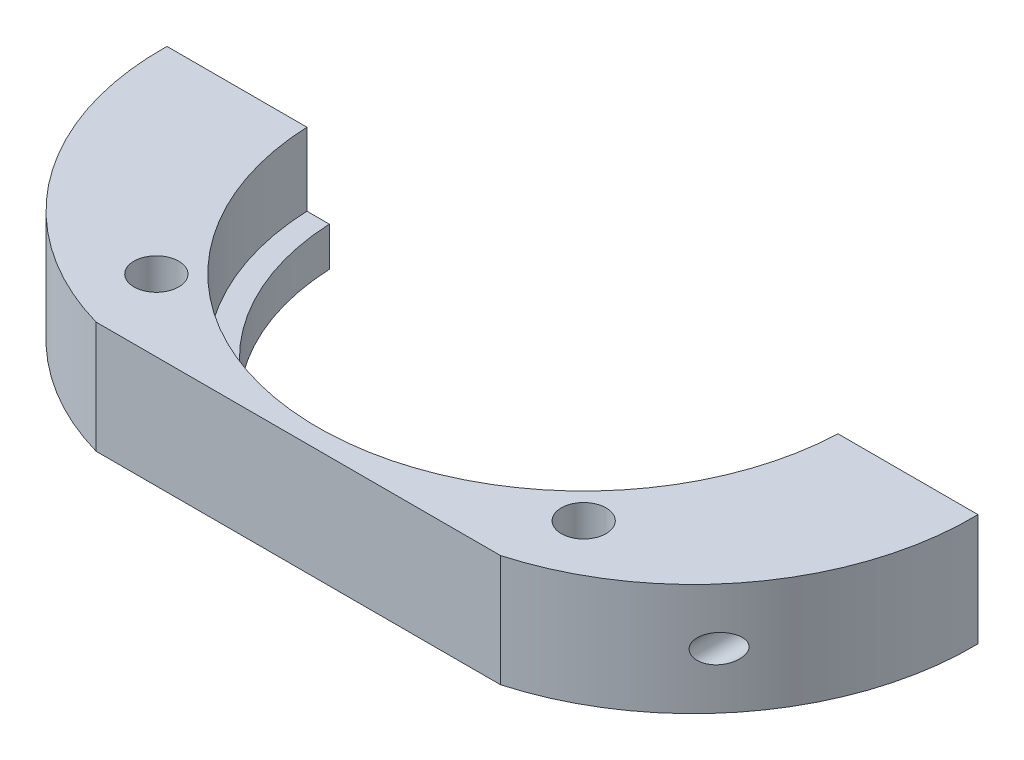
ISO-10303-21;
HEADER;
FILE_DESCRIPTION(('STEP AP214'),'2;1');
FILE_NAME('part.step','',(''),(''),'','','');
FILE_SCHEMA(('AUTOMOTIVE_DESIGN { 1 0 10303 214 1 1 1 1 }'));
ENDSEC;
DATA;
#1=APPLICATION_CONTEXT('core data for automotive mechanical design processes');
#2=APPLICATION_PROTOCOL_DEFINITION('international standard','automotive_design',2000,#1);
#3=PRODUCT_CONTEXT('',#1,'mechanical');
#4=PRODUCT('Part','Part','',(#3));
#5=PRODUCT_RELATED_PRODUCT_CATEGORY('part','',(#4));
#6=PRODUCT_DEFINITION_FORMATION('','',#4);
#7=PRODUCT_DEFINITION_CONTEXT('part definition',#1,'design');
#8=PRODUCT_DEFINITION('design','',#6,#7);
#9=PRODUCT_DEFINITION_SHAPE('','',#8);
#10=(LENGTH_UNIT() NAMED_UNIT(*) SI_UNIT(.MILLI.,.METRE.));
#11=(NAMED_UNIT(*) PLANE_ANGLE_UNIT() SI_UNIT($,.RADIAN.));
#12=(NAMED_UNIT(*) SI_UNIT($,.STERADIAN.) SOLID_ANGLE_UNIT());
#13=UNCERTAINTY_MEASURE_WITH_UNIT(LENGTH_MEASURE(1.E-05),#10,'distance_accuracy_value','');
#14=(GEOMETRIC_REPRESENTATION_CONTEXT(3) GLOBAL_UNCERTAINTY_ASSIGNED_CONTEXT((#13)) GLOBAL_UNIT_ASSIGNED_CONTEXT((#10,
#11,#12)) REPRESENTATION_CONTEXT('',''));
#15=CARTESIAN_POINT('',(0.,0.,0.));
#16=DIRECTION('',(0.,0.,1.));
#17=DIRECTION('',(1.,0.,0.));
#18=AXIS2_PLACEMENT_3D('',#15,#16,#17);
#19=CARTESIAN_POINT('',(0.,20.,0.));
#20=DIRECTION('',(0.,-1.,0.));
#21=DIRECTION('',(0.,0.,-1.));
#22=AXIS2_PLACEMENT_3D('',#19,#20,#21);
#23=CYLINDRICAL_SURFACE('',#22,43.5);
#24=DIRECTION('',(0.,-1.,0.));
#25=VECTOR('',#24,1.);
#26=CARTESIAN_POINT('',(-43.4539986652552,20.,2.));
#27=LINE('',#26,#25);
#28=CARTESIAN_POINT('',(-43.4539986652552,7.,2.));
#29=VERTEX_POINT('',#28);
#30=CARTESIAN_POINT('',(-43.4539986652552,0.,2.));
#31=VERTEX_POINT('',#30);
#32=EDGE_CURVE('E146',#29,#31,#27,.T.);
#33=ORIENTED_EDGE('',*,*,#32,.F.);
#34=CARTESIAN_POINT('',(0.,7.,0.));
#35=DIRECTION('',(0.,1.,0.));
#36=DIRECTION('',(0.,0.,1.));
#37=AXIS2_PLACEMENT_3D('',#34,#35,#36);
#38=CIRCLE('',#37,43.5);
#39=CARTESIAN_POINT('',(43.4539986652552,7.,1.99999999999999));
#40=VERTEX_POINT('',#39);
#41=EDGE_CURVE('E164',#29,#40,#38,.T.);
#42=ORIENTED_EDGE('',*,*,#41,.T.);
#43=DIRECTION('',(0.,-1.,0.));
#44=VECTOR('',#43,1.);
#45=CARTESIAN_POINT('',(43.4539986652552,20.,1.99999999999999));
#46=LINE('',#45,#44);
#47=CARTESIAN_POINT('',(43.4539986652552,0.,1.99999999999999));
#48=VERTEX_POINT('',#47);
#49=EDGE_CURVE('E65',#48,#40,#46,.F.);
#50=ORIENTED_EDGE('',*,*,#49,.F.);
#51=CARTESIAN_POINT('',(0.,0.,0.));
#52=DIRECTION('',(0.,1.,0.));
#53=DIRECTION('',(0.,0.,1.));
#54=AXIS2_PLACEMENT_3D('',#51,#52,#53);
#55=CIRCLE('',#54,43.5);
#56=EDGE_CURVE('E167',#31,#48,#55,.T.);
#57=ORIENTED_EDGE('',*,*,#56,.F.);
#58=EDGE_LOOP('',(#33,#42,#50,#57));
#59=FACE_BOUND('',#58,.T.);
#60=ADVANCED_FACE('F41',(#59),#23,.F.);
#61=CARTESIAN_POINT('',(0.,20.,0.));
#62=DIRECTION('',(0.,1.,0.));
#63=DIRECTION('',(0.,0.,1.));
#64=AXIS2_PLACEMENT_3D('',#61,#62,#63);
#65=PLANE('',#64);
#66=DIRECTION('',(1.,0.,0.));
#67=VECTOR('',#66,1.);
#68=CARTESIAN_POINT('',(-75.,20.,2.));
#69=LINE('',#68,#67);
#70=CARTESIAN_POINT('',(-72.467991803803,20.,2.));
#71=VERTEX_POINT('',#70);
#72=CARTESIAN_POINT('',(-47.4578760586691,20.,2.));
#73=VERTEX_POINT('',#72);
#74=EDGE_CURVE('E266',#71,#73,#69,.T.);
#75=ORIENTED_EDGE('',*,*,#74,.F.);
#76=CARTESIAN_POINT('',(-22.4760908283651,20.,2.89990936322075));
#77=DIRECTION('',(0.,1.,0.));
#78=DIRECTION('',(0.,0.,1.));
#79=AXIS2_PLACEMENT_3D('',#76,#77,#78);
#80=CIRCLE('',#79,50.);
#81=CARTESIAN_POINT('',(-36.1282437990003,20.,51.));
#82=VERTEX_POINT('',#81);
#83=EDGE_CURVE('E259',#82,#71,#80,.F.);
#84=ORIENTED_EDGE('',*,*,#83,.F.);
#85=DIRECTION('',(-1.,0.,0.));
#86=VECTOR('',#85,1.);
#87=CARTESIAN_POINT('',(-36.1282437990003,20.,51.));
#88=LINE('',#87,#86);
#89=CARTESIAN_POINT('',(36.1282437990003,20.,51.));
#90=VERTEX_POINT('',#89);
#91=EDGE_CURVE('E131',#90,#82,#88,.T.);
#92=ORIENTED_EDGE('',*,*,#91,.F.);
#93=CARTESIAN_POINT('',(22.4760908283651,20.,2.89990936322075));
#94=DIRECTION('',(0.,1.,0.));
#95=DIRECTION('',(0.,0.,1.));
#96=AXIS2_PLACEMENT_3D('',#93,#94,#95);
#97=CIRCLE('',#96,50.);
#98=CARTESIAN_POINT('',(72.467991803803,20.,1.99999999999999));
#99=VERTEX_POINT('',#98);
#100=EDGE_CURVE('E113',#90,#99,#97,.T.);
#101=ORIENTED_EDGE('',*,*,#100,.T.);
#102=CARTESIAN_POINT('',(47.4578760586691,20.,1.99999999999999));
#103=VERTEX_POINT('',#102);
#104=EDGE_CURVE('E136',#103,#99,#69,.T.);
#105=ORIENTED_EDGE('',*,*,#104,.F.);
#106=CARTESIAN_POINT('',(0.,20.,0.));
#107=DIRECTION('',(0.,1.,0.));
#108=DIRECTION('',(0.,0.,1.));
#109=AXIS2_PLACEMENT_3D('',#106,#107,#108);
#110=CIRCLE('',#109,47.5);
#111=EDGE_CURVE('E152',#73,#103,#110,.T.);
#112=ORIENTED_EDGE('',*,*,#111,.F.);
#113=EDGE_LOOP('',(#75,#84,#92,#101,#105,#112));
#114=FACE_BOUND('',#113,.T.);
#115=CARTESIAN_POINT('',(-38.1837661840735,20.,38.1837661840736));
#116=DIRECTION('',(0.,1.,0.));
#117=DIRECTION('',(0.,0.,1.));
#118=AXIS2_PLACEMENT_3D('',#115,#116,#117);
#119=CIRCLE('',#118,4.00000000000001);
#120=CARTESIAN_POINT('',(-38.1837661840735,20.,42.1837661840737));
#121=VERTEX_POINT('',#120);
#122=EDGE_CURVE('E148',#121,#121,#119,.T.);
#123=ORIENTED_EDGE('',*,*,#122,.F.);
#124=EDGE_LOOP('',(#123));
#125=FACE_BOUND('',#124,.T.);
#126=CARTESIAN_POINT('',(38.1837661840736,20.,38.1837661840735));
#127=DIRECTION('',(0.,1.,0.));
#128=DIRECTION('',(0.,0.,1.));
#129=AXIS2_PLACEMENT_3D('',#126,#127,#128);
#130=CIRCLE('',#129,4.00000000000001);
#131=CARTESIAN_POINT('',(38.1837661840736,20.,42.1837661840735));
#132=VERTEX_POINT('',#131);
#133=EDGE_CURVE('E153',#132,#132,#130,.T.);
#134=ORIENTED_EDGE('',*,*,#133,.F.);
#135=EDGE_LOOP('',(#134));
#136=FACE_BOUND('',#135,.T.);
#137=ADVANCED_FACE('F214',(#114,#125,#136),#65,.T.);
#138=CARTESIAN_POINT('',(0.,0.,0.));
#139=DIRECTION('',(0.,1.,0.));
#140=DIRECTION('',(0.,0.,1.));
#141=AXIS2_PLACEMENT_3D('',#138,#139,#140);
#142=PLANE('',#141);
#143=CARTESIAN_POINT('',(-38.1837661840735,0.,38.1837661840736));
#144=DIRECTION('',(0.,1.,0.));
#145=DIRECTION('',(0.,0.,1.));
#146=AXIS2_PLACEMENT_3D('',#143,#144,#145);
#147=CIRCLE('',#146,4.00000000000001);
#148=CARTESIAN_POINT('',(-38.1837661840735,0.,42.1837661840737));
#149=VERTEX_POINT('',#148);
#150=EDGE_CURVE('E156',#149,#149,#147,.T.);
#151=ORIENTED_EDGE('',*,*,#150,.T.);
#152=EDGE_LOOP('',(#151));
#153=FACE_BOUND('',#152,.T.);
#154=CARTESIAN_POINT('',(38.1837661840736,0.,38.1837661840735));
#155=DIRECTION('',(0.,1.,0.));
#156=DIRECTION('',(0.,0.,1.));
#157=AXIS2_PLACEMENT_3D('',#154,#155,#156);
#158=CIRCLE('',#157,4.00000000000001);
#159=CARTESIAN_POINT('',(38.1837661840736,0.,42.1837661840735));
#160=VERTEX_POINT('',#159);
#161=EDGE_CURVE('E149',#160,#160,#158,.T.);
#162=ORIENTED_EDGE('',*,*,#161,.T.);
#163=EDGE_LOOP('',(#162));
#164=FACE_BOUND('',#163,.T.);
#165=DIRECTION('',(-1.,0.,0.));
#166=VECTOR('',#165,1.);
#167=CARTESIAN_POINT('',(-36.1282437990003,0.,51.));
#168=LINE('',#167,#166);
#169=CARTESIAN_POINT('',(36.1282437990003,0.,51.));
#170=VERTEX_POINT('',#169);
#171=CARTESIAN_POINT('',(-36.1282437990003,0.,51.));
#172=VERTEX_POINT('',#171);
#173=EDGE_CURVE('E118',#170,#172,#168,.T.);
#174=ORIENTED_EDGE('',*,*,#173,.T.);
#175=CARTESIAN_POINT('',(-22.4760908283651,0.,2.89990936322075));
#176=DIRECTION('',(0.,1.,0.));
#177=DIRECTION('',(0.,0.,1.));
#178=AXIS2_PLACEMENT_3D('',#175,#176,#177);
#179=CIRCLE('',#178,50.);
#180=CARTESIAN_POINT('',(-72.467991803803,0.,2.));
#181=VERTEX_POINT('',#180);
#182=EDGE_CURVE('E261',#172,#181,#179,.F.);
#183=ORIENTED_EDGE('',*,*,#182,.T.);
#184=DIRECTION('',(1.,0.,0.));
#185=VECTOR('',#184,1.);
#186=CARTESIAN_POINT('',(-75.,0.,2.));
#187=LINE('',#186,#185);
#188=EDGE_CURVE('E143',#181,#31,#187,.T.);
#189=ORIENTED_EDGE('',*,*,#188,.T.);
#190=ORIENTED_EDGE('',*,*,#56,.T.);
#191=CARTESIAN_POINT('',(72.467991803803,0.,1.99999999999999));
#192=VERTEX_POINT('',#191);
#193=EDGE_CURVE('E125',#48,#192,#187,.T.);
#194=ORIENTED_EDGE('',*,*,#193,.T.);
#195=CARTESIAN_POINT('',(22.4760908283651,0.,2.89990936322075));
#196=DIRECTION('',(0.,1.,0.));
#197=DIRECTION('',(0.,0.,1.));
#198=AXIS2_PLACEMENT_3D('',#195,#196,#197);
#199=CIRCLE('',#198,50.);
#200=EDGE_CURVE('E111',#170,#192,#199,.T.);
#201=ORIENTED_EDGE('',*,*,#200,.F.);
#202=EDGE_LOOP('',(#174,#183,#189,#190,#194,#201));
#203=FACE_BOUND('',#202,.T.);
#204=ADVANCED_FACE('F43',(#153,#164,#203),#142,.F.);
#205=CARTESIAN_POINT('',(0.,7.,0.));
#206=DIRECTION('',(0.,1.,0.));
#207=DIRECTION('',(0.,0.,1.));
#208=AXIS2_PLACEMENT_3D('',#205,#206,#207);
#209=CYLINDRICAL_SURFACE('',#208,47.5);
#210=ORIENTED_EDGE('',*,*,#111,.T.);
#211=DIRECTION('',(0.,1.,0.));
#212=VECTOR('',#211,1.);
#213=CARTESIAN_POINT('',(47.4578760586691,7.,1.99999999999999));
#214=LINE('',#213,#212);
#215=CARTESIAN_POINT('',(47.4578760586691,7.,1.99999999999999));
#216=VERTEX_POINT('',#215);
#217=EDGE_CURVE('E140',#103,#216,#214,.F.);
#218=ORIENTED_EDGE('',*,*,#217,.T.);
#219=CARTESIAN_POINT('',(0.,7.,0.));
#220=DIRECTION('',(0.,1.,0.));
#221=DIRECTION('',(0.,0.,1.));
#222=AXIS2_PLACEMENT_3D('',#219,#220,#221);
#223=CIRCLE('',#222,47.5);
#224=CARTESIAN_POINT('',(-47.4578760586691,7.,2.));
#225=VERTEX_POINT('',#224);
#226=EDGE_CURVE('E161',#225,#216,#223,.T.);
#227=ORIENTED_EDGE('',*,*,#226,.F.);
#228=DIRECTION('',(0.,1.,0.));
#229=VECTOR('',#228,1.);
#230=CARTESIAN_POINT('',(-47.4578760586691,7.,2.));
#231=LINE('',#230,#229);
#232=EDGE_CURVE('E57',#225,#73,#231,.T.);
#233=ORIENTED_EDGE('',*,*,#232,.T.);
#234=EDGE_LOOP('',(#210,#218,#227,#233));
#235=FACE_BOUND('',#234,.T.);
#236=ADVANCED_FACE('F224',(#235),#209,.F.);
#237=CARTESIAN_POINT('',(0.,7.,0.));
#238=DIRECTION('',(0.,1.,0.));
#239=DIRECTION('',(0.,0.,1.));
#240=AXIS2_PLACEMENT_3D('',#237,#238,#239);
#241=PLANE('',#240);
#242=DIRECTION('',(1.,0.,0.));
#243=VECTOR('',#242,1.);
#244=CARTESIAN_POINT('',(0.,7.,1.99999999999999));
#245=LINE('',#244,#243);
#246=EDGE_CURVE('E11',#225,#29,#245,.T.);
#247=ORIENTED_EDGE('',*,*,#246,.F.);
#248=ORIENTED_EDGE('',*,*,#226,.T.);
#249=EDGE_CURVE('E50',#40,#216,#245,.T.);
#250=ORIENTED_EDGE('',*,*,#249,.F.);
#251=ORIENTED_EDGE('',*,*,#41,.F.);
#252=EDGE_LOOP('',(#247,#248,#250,#251));
#253=FACE_BOUND('',#252,.T.);
#254=ADVANCED_FACE('F226',(#253),#241,.T.);
#255=CARTESIAN_POINT('',(38.1837661840736,0.,38.1837661840735));
#256=DIRECTION('',(0.,1.,0.));
#257=DIRECTION('',(0.,0.,1.));
#258=AXIS2_PLACEMENT_3D('',#255,#256,#257);
#259=CYLINDRICAL_SURFACE('',#258,4.00000000000001);
#260=ORIENTED_EDGE('',*,*,#161,.F.);
#261=EDGE_LOOP('',(#260));
#262=FACE_BOUND('',#261,.T.);
#263=ORIENTED_EDGE('',*,*,#133,.T.);
#264=EDGE_LOOP('',(#263));
#265=FACE_BOUND('',#264,.T.);
#266=ADVANCED_FACE('F230',(#262,#265),#259,.F.);
#267=CARTESIAN_POINT('',(-38.1837661840735,0.,38.1837661840736));
#268=DIRECTION('',(0.,1.,0.));
#269=DIRECTION('',(0.,0.,1.));
#270=AXIS2_PLACEMENT_3D('',#267,#268,#269);
#271=CYLINDRICAL_SURFACE('',#270,4.00000000000001);
#272=ORIENTED_EDGE('',*,*,#150,.F.);
#273=EDGE_LOOP('',(#272));
#274=FACE_BOUND('',#273,.T.);
#275=ORIENTED_EDGE('',*,*,#122,.T.);
#276=EDGE_LOOP('',(#275));
#277=FACE_BOUND('',#276,.T.);
#278=ADVANCED_FACE('F232',(#274,#277),#271,.F.);
#279=CARTESIAN_POINT('',(-75.,0.,2.));
#280=DIRECTION('',(0.,0.,1.));
#281=DIRECTION('',(1.,0.,0.));
#282=AXIS2_PLACEMENT_3D('',#279,#280,#281);
#283=PLANE('',#282);
#284=CARTESIAN_POINT('',(59.9629339312361,10.,1.99999999999998));
#285=DIRECTION('',(0.,0.,-1.));
#286=DIRECTION('',(-1.,0.,0.));
#287=AXIS2_PLACEMENT_3D('',#284,#285,#286);
#288=CIRCLE('',#287,4.025);
#289=CARTESIAN_POINT('',(55.9379339312361,10.,1.99999999999998));
#290=VERTEX_POINT('',#289);
#291=EDGE_CURVE('E285',#290,#290,#288,.T.);
#292=ORIENTED_EDGE('',*,*,#291,.F.);
#293=EDGE_LOOP('',(#292));
#294=FACE_BOUND('',#293,.T.);
#295=ORIENTED_EDGE('',*,*,#193,.F.);
#296=ORIENTED_EDGE('',*,*,#49,.T.);
#297=ORIENTED_EDGE('',*,*,#249,.T.);
#298=ORIENTED_EDGE('',*,*,#217,.F.);
#299=ORIENTED_EDGE('',*,*,#104,.T.);
#300=DIRECTION('',(0.,1.,0.));
#301=VECTOR('',#300,1.);
#302=CARTESIAN_POINT('',(72.467991803803,0.,1.99999999999999));
#303=LINE('',#302,#301);
#304=EDGE_CURVE('E127',#192,#99,#303,.T.);
#305=ORIENTED_EDGE('',*,*,#304,.F.);
#306=EDGE_LOOP('',(#295,#296,#297,#298,#299,#305));
#307=FACE_BOUND('',#306,.T.);
#308=ADVANCED_FACE('F235',(#294,#307),#283,.F.);
#309=CARTESIAN_POINT('',(-59.9629339312361,10.,2.));
#310=DIRECTION('',(0.,0.,-1.));
#311=DIRECTION('',(-1.,0.,0.));
#312=AXIS2_PLACEMENT_3D('',#309,#310,#311);
#313=CIRCLE('',#312,4.025);
#314=CARTESIAN_POINT('',(-63.9879339312361,10.,2.));
#315=VERTEX_POINT('',#314);
#316=EDGE_CURVE('E276',#315,#315,#313,.T.);
#317=ORIENTED_EDGE('',*,*,#316,.F.);
#318=EDGE_LOOP('',(#317));
#319=FACE_BOUND('',#318,.T.);
#320=ORIENTED_EDGE('',*,*,#74,.T.);
#321=ORIENTED_EDGE('',*,*,#232,.F.);
#322=ORIENTED_EDGE('',*,*,#246,.T.);
#323=ORIENTED_EDGE('',*,*,#32,.T.);
#324=ORIENTED_EDGE('',*,*,#188,.F.);
#325=DIRECTION('',(0.,1.,0.));
#326=VECTOR('',#325,1.);
#327=CARTESIAN_POINT('',(-72.467991803803,0.,2.));
#328=LINE('',#327,#326);
#329=EDGE_CURVE('E133',#181,#71,#328,.T.);
#330=ORIENTED_EDGE('',*,*,#329,.T.);
#331=EDGE_LOOP('',(#320,#321,#322,#323,#324,#330));
#332=FACE_BOUND('',#331,.T.);
#333=ADVANCED_FACE('F243',(#319,#332),#283,.F.);
#334=CARTESIAN_POINT('',(-36.1282437990003,0.,51.));
#335=DIRECTION('',(0.,0.,-1.));
#336=DIRECTION('',(-1.,0.,0.));
#337=AXIS2_PLACEMENT_3D('',#334,#335,#336);
#338=PLANE('',#337);
#339=ORIENTED_EDGE('',*,*,#91,.T.);
#340=DIRECTION('',(0.,1.,0.));
#341=VECTOR('',#340,1.);
#342=CARTESIAN_POINT('',(-36.1282437990003,0.,51.));
#343=LINE('',#342,#341);
#344=EDGE_CURVE('E117',#172,#82,#343,.T.);
#345=ORIENTED_EDGE('',*,*,#344,.F.);
#346=ORIENTED_EDGE('',*,*,#173,.F.);
#347=DIRECTION('',(0.,1.,0.));
#348=VECTOR('',#347,1.);
#349=CARTESIAN_POINT('',(36.1282437990003,0.,51.));
#350=LINE('',#349,#348);
#351=EDGE_CURVE('E107',#170,#90,#350,.T.);
#352=ORIENTED_EDGE('',*,*,#351,.T.);
#353=EDGE_LOOP('',(#339,#345,#346,#352));
#354=FACE_BOUND('',#353,.T.);
#355=ADVANCED_FACE('F129',(#354),#338,.F.);
#356=CARTESIAN_POINT('',(-22.4760908283651,0.,2.89990936322075));
#357=DIRECTION('',(0.,1.,0.));
#358=DIRECTION('',(0.,0.,1.));
#359=AXIS2_PLACEMENT_3D('',#356,#357,#358);
#360=CYLINDRICAL_SURFACE('',#359,50.);
#361=CARTESIAN_POINT('',(-63.3629339312361,10.,31.6795212626404));
#362=CARTESIAN_POINT('',(-63.3629343253646,10.0687356319262,31.6795206866059));
#363=CARTESIAN_POINT('',(-63.3608437410406,10.1374698240647,31.6824914506178));
#364=CARTESIAN_POINT('',(-63.3525504305789,10.2742176845475,31.6942682166826));
#365=CARTESIAN_POINT('',(-63.3463454708273,10.3422309411225,31.7030773882918));
#366=CARTESIAN_POINT('',(-63.330000012413,10.4769466379987,31.7262567521344));
#367=CARTESIAN_POINT('',(-63.3198522033584,10.5436464001833,31.7406372740015));
#368=CARTESIAN_POINT('',(-63.2959116563995,10.6750789816758,31.7745116669967));
#369=CARTESIAN_POINT('',(-63.2821167406185,10.739810599864,31.7940085933437));
#370=CARTESIAN_POINT('',(-63.2361666189003,10.928744118272,31.8588283423903));
#371=CARTESIAN_POINT('',(-63.199204332202,11.0495474117393,31.9108251195941));
#372=CARTESIAN_POINT('',(-63.1151276526763,11.2801577607404,32.0284852970135));
#373=CARTESIAN_POINT('',(-63.0680105968522,11.3899619207658,32.0941522819634));
#374=CARTESIAN_POINT('',(-62.9339460467734,11.6639585438838,32.2798651443603));
#375=CARTESIAN_POINT('',(-62.8404920850483,11.8193277767616,32.4082721584818));
#376=CARTESIAN_POINT('',(-62.6897497997489,12.0327532780433,32.6130209365152));
#377=CARTESIAN_POINT('',(-62.6376326298726,12.1007344831081,32.6834394997413));
#378=CARTESIAN_POINT('',(-62.530357779274,12.2305645379109,32.8275509302823));
#379=CARTESIAN_POINT('',(-62.4752008233424,12.2924148397107,32.9012430162696));
#380=CARTESIAN_POINT('',(-62.3282770164443,12.4458713492224,33.0963637063599));
#381=CARTESIAN_POINT('',(-62.2344707353584,12.5329598756038,33.2198087728626));
#382=CARTESIAN_POINT('',(-62.0414615221016,12.693601112363,33.4712456996677));
#383=CARTESIAN_POINT('',(-61.942255430183,12.7671457846777,33.5992402065824));
#384=CARTESIAN_POINT('',(-61.7393067586724,12.9016071760518,33.8583812786916));
#385=CARTESIAN_POINT('',(-61.6355607784039,12.9625142256185,33.9895301724307));
#386=CARTESIAN_POINT('',(-61.4243091023683,13.0722211746513,34.2537753264019));
#387=CARTESIAN_POINT('',(-61.3168041074958,13.1210233175712,34.3868712209387));
#388=CARTESIAN_POINT('',(-61.0931682750898,13.2090049814337,34.6607990766237));
#389=CARTESIAN_POINT('',(-60.9768737355676,13.2475895893844,34.8016882247869));
#390=CARTESIAN_POINT('',(-60.7412824980919,13.3119608826084,35.0838945000289));
#391=CARTESIAN_POINT('',(-60.6219855269891,13.3377463990161,35.2252116650107));
#392=CARTESIAN_POINT('',(-60.3809750897698,13.3764081421366,35.5074879429977));
#393=CARTESIAN_POINT('',(-60.2592622846771,13.3892878518196,35.6484471423606));
#394=CARTESIAN_POINT('',(-60.0139737959925,13.4018339495662,35.9293219965637));
#395=CARTESIAN_POINT('',(-59.8903982779077,13.4015015047273,36.0692377424854));
#396=CARTESIAN_POINT('',(-59.6487746231976,13.3874978835237,36.339745812837));
#397=CARTESIAN_POINT('',(-59.5307903301629,13.3745513347659,36.4704321420177));
#398=CARTESIAN_POINT('',(-59.2943917157552,13.3357758356127,36.7295335686755));
#399=CARTESIAN_POINT('',(-59.1759773537051,13.3099456333906,36.8579484441934));
#400=CARTESIAN_POINT('',(-58.9396601215898,13.2446760921927,37.11157567088));
#401=CARTESIAN_POINT('',(-58.8217568827809,13.2052492210902,37.2367908435181));
#402=CARTESIAN_POINT('',(-58.5874747630514,13.1119132872493,37.4830968531318));
#403=CARTESIAN_POINT('',(-58.4710953002314,13.0580099326124,37.6041892945475));
#404=CARTESIAN_POINT('',(-58.1954991743462,12.9102251610865,37.8881482490508));
#405=CARTESIAN_POINT('',(-58.0375845106017,12.8089661898772,38.0485512001167));
#406=CARTESIAN_POINT('',(-57.7324674669168,12.5733376443751,38.3545907033303));
#407=CARTESIAN_POINT('',(-57.5852499187897,12.4390161871331,38.5002482840312));
#408=CARTESIAN_POINT('',(-57.3414023212565,12.1707746029251,38.7388834546638));
#409=CARTESIAN_POINT('',(-57.2410114427707,12.0441684277568,38.8361993242526));
#410=CARTESIAN_POINT('',(-57.0553915454894,11.7701631585125,39.0148440138304));
#411=CARTESIAN_POINT('',(-56.9701435953079,11.6227904458554,39.0961928090903));
#412=CARTESIAN_POINT('',(-56.8336231856805,11.3370827436366,39.2257573159105));
#413=CARTESIAN_POINT('',(-56.778999126389,11.2018700981031,39.2772989991099));
#414=CARTESIAN_POINT('',(-56.6866631445926,10.9208036324825,39.364149130578));
#415=CARTESIAN_POINT('',(-56.6489419646604,10.7749556881925,39.3994664649217));
#416=CARTESIAN_POINT('',(-56.5928884952155,10.4755020114979,39.451867419091));
#417=CARTESIAN_POINT('',(-56.5746601096092,10.3218592335711,39.4688533299304));
#418=CARTESIAN_POINT('',(-56.5594389170208,10.0126196060326,39.483040854107));
#419=CARTESIAN_POINT('',(-56.5624401373302,9.8570233183151,39.4802480319658));
#420=CARTESIAN_POINT('',(-56.5881873703442,9.56306350733776,39.4562372479841));
#421=CARTESIAN_POINT('',(-56.6091523964301,9.42439870879384,39.4366811778056));
#422=CARTESIAN_POINT('',(-56.6670689207072,9.15356021435374,39.3824884395396));
#423=CARTESIAN_POINT('',(-56.7040216597743,9.02138702318629,39.3478506008891));
#424=CARTESIAN_POINT('',(-56.7936378471042,8.76091828196372,39.2634882968493));
#425=CARTESIAN_POINT('',(-56.8468908656443,8.63301272092612,39.2131962153582));
#426=CARTESIAN_POINT('',(-56.9657565650929,8.38897854943374,39.1003195166353));
#427=CARTESIAN_POINT('',(-57.031376013324,8.27285644105927,39.03772816803));
#428=CARTESIAN_POINT('',(-57.2065257415862,8.00007954923629,38.8695874242304));
#429=CARTESIAN_POINT('',(-57.32194833766,7.85096807460068,38.7578986440388));
#430=CARTESIAN_POINT('',(-57.5671885174114,7.58051560199774,38.5179461230284));
#431=CARTESIAN_POINT('',(-57.6970376984098,7.45923741811491,38.389645893826));
#432=CARTESIAN_POINT('',(-58.0177798289457,7.20114656747552,38.0688911560903));
#433=CARTESIAN_POINT('',(-58.2128562949509,7.07647194689081,37.8708181389549));
#434=CARTESIAN_POINT('',(-58.5108837381666,6.92363040246692,37.5627785995459));
#435=CARTESIAN_POINT('',(-58.611241154028,6.87834750685803,37.4581565735203));
#436=CARTESIAN_POINT('',(-58.8130423760045,6.7985143613599,37.2459033149262));
#437=CARTESIAN_POINT('',(-58.9144859075758,6.76396146249117,37.1382728322372));
#438=CARTESIAN_POINT('',(-59.1536980669308,6.69460003218799,36.8821657856478));
#439=CARTESIAN_POINT('',(-59.2916316500795,6.66401850156403,36.7326992361982));
#440=CARTESIAN_POINT('',(-59.5669158257783,6.62026655560375,36.4306785665527));
#441=CARTESIAN_POINT('',(-59.7042661942885,6.60710231726534,36.2781233704402));
#442=CARTESIAN_POINT('',(-59.9775546897703,6.59727842218645,35.9707812871656));
#443=CARTESIAN_POINT('',(-60.1134899927203,6.6006470923779,35.8159910231227));
#444=CARTESIAN_POINT('',(-60.3828386154914,6.62332349964263,35.5054413996577));
#445=CARTESIAN_POINT('',(-60.5162522806391,6.642629037819,35.3496821768707));
#446=CARTESIAN_POINT('',(-60.7821629129681,6.69733195476989,35.0353719956322));
#447=CARTESIAN_POINT('',(-60.9146018880372,6.73300802724923,34.8768204064946));
#448=CARTESIAN_POINT('',(-61.1753763769462,6.82054906450314,34.5607256082868));
#449=CARTESIAN_POINT('',(-61.3037107772248,6.8724183820764,34.4031826819823));
#450=CARTESIAN_POINT('',(-61.5550805749826,6.99260322432295,34.0908157269312));
#451=CARTESIAN_POINT('',(-61.6781282928842,7.06087775727407,33.9359859374886));
#452=CARTESIAN_POINT('',(-61.9181286839422,7.21476692823167,33.6304047927721));
#453=CARTESIAN_POINT('',(-62.0350857114466,7.30036895842871,33.4796505619394));
#454=CARTESIAN_POINT('',(-62.267491177689,7.49535578399166,33.1766786453361));
#455=CARTESIAN_POINT('',(-62.3825405387637,7.60575055971819,33.0247970554514));
#456=CARTESIAN_POINT('',(-62.6018054805694,7.84982442249939,32.7321118910437));
#457=CARTESIAN_POINT('',(-62.706029539289,7.98348506564146,32.5912996687291));
#458=CARTESIAN_POINT('',(-62.8778059408276,8.24438804447979,32.3569567618358));
#459=CARTESIAN_POINT('',(-62.9483552628305,8.36642650053984,32.2598813516731));
#460=CARTESIAN_POINT('',(-63.0770501350418,8.6276390095593,32.0816523513499));
#461=CARTESIAN_POINT('',(-63.1352174657628,8.76678228244173,32.0004708236331));
#462=CARTESIAN_POINT('',(-63.2205500947263,9.02000209328455,31.8808143873429));
#463=CARTESIAN_POINT('',(-63.2518305583122,9.13003297200464,31.8367549937028));
#464=CARTESIAN_POINT('',(-63.3036538379061,9.35729223933968,31.7635912552603));
#465=CARTESIAN_POINT('',(-63.3242219691228,9.47450292070797,31.7344516550311));
#466=CARTESIAN_POINT('',(-63.3466245686709,9.66061109958829,31.7026809669896));
#467=CARTESIAN_POINT('',(-63.3527204094026,9.72802521907343,31.6940268085609));
#468=CARTESIAN_POINT('',(-63.360875476485,9.86362655334139,31.6824464172565));
#469=CARTESIAN_POINT('',(-63.362933540259,9.93181398509793,31.6795218340688));
#470=CARTESIAN_POINT('',(-63.3629339312361,10.,31.6795212626404));
#471=B_SPLINE_CURVE_WITH_KNOTS('',3,(#361,#362,#363,#364,#365,#366,#367,#368,#369,#370,#371,
#372,#373,#374,#375,#376,#377,#378,#379,#380,#381,#382,#383,#384,#385,#386,#387,#388,#389,#390,
#391,#392,#393,#394,#395,#396,#397,#398,#399,#400,#401,#402,#403,#404,#405,#406,#407,#408,#409,
#410,#411,#412,#413,#414,#415,#416,#417,#418,#419,#420,#421,#422,#423,#424,#425,#426,#427,#428,
#429,#430,#431,#432,#433,#434,#435,#436,#437,#438,#439,#440,#441,#442,#443,#444,#445,#446,#447,
#448,#449,#450,#451,#452,#453,#454,#455,#456,#457,#458,#459,#460,#461,#462,#463,#464,#465,#466,
#467,#468,#469,#470),.UNSPECIFIED.,.T.,.F.,(4,2,2,2,2,2,2,2,2,2,2,2,2,2,2,2,2,2,2,2,2,2,2,2,2,2,
2,2,2,2,2,2,2,2,2,2,2,2,2,2,2,2,2,2,2,2,2,2,2,2,2,2,2,2,4),(0.,0.206110011406493,
0.41233200762189,0.618938196413832,0.825668040251382,1.23348348813143,1.64140601234304,
2.30390390874567,2.63642332361921,2.9688637944628,3.50155188642737,4.03455510863115,
4.56796465873018,5.10127527577211,5.66094844424522,6.22067271496783,6.78024588871195,
7.33976963258782,7.86893825051597,8.39815829458463,8.92689433919514,9.45542220762335,
10.1934116363491,10.9303333271241,11.4941916815941,12.0573400728869,12.5194517416248,
12.9813100091863,13.4456180673761,13.9097955029648,14.3326628078974,14.7555629392907,
15.1960541668644,15.6367871495909,16.290582161416,16.9458384562198,17.854563293095,
18.309923542519,18.7651712848554,19.3813407974644,19.9977287744839,20.6151732183437,
21.2325324842501,21.8608156579685,22.4892678619398,23.1161657894808,23.7426092035699,
24.4018277812089,25.0605261266961,25.5724790552873,26.0835238532891,26.4499839158956,
26.815573991027,27.0199770819397,27.2244390169708),.UNSPECIFIED.);
#472=CARTESIAN_POINT('',(-63.3629339312361,10.,31.6795212626404));
#473=VERTEX_POINT('',#472);
#474=EDGE_CURVE('E178',#473,#473,#471,.T.);
#475=ORIENTED_EDGE('',*,*,#474,.T.);
#476=EDGE_LOOP('',(#475));
#477=FACE_BOUND('',#476,.T.);
#478=ORIENTED_EDGE('',*,*,#83,.T.);
#479=ORIENTED_EDGE('',*,*,#329,.F.);
#480=ORIENTED_EDGE('',*,*,#182,.F.);
#481=ORIENTED_EDGE('',*,*,#344,.T.);
#482=EDGE_LOOP('',(#478,#479,#480,#481));
#483=FACE_BOUND('',#482,.T.);
#484=ADVANCED_FACE('F242',(#477,#483),#360,.T.);
#485=CARTESIAN_POINT('',(22.4760908283651,0.,2.89990936322075));
#486=DIRECTION('',(0.,1.,0.));
#487=DIRECTION('',(0.,0.,1.));
#488=AXIS2_PLACEMENT_3D('',#485,#486,#487);
#489=CYLINDRICAL_SURFACE('',#488,50.);
#490=CARTESIAN_POINT('',(57.4629339312361,10.,38.6199430935392));
#491=CARTESIAN_POINT('',(57.4629435255886,9.88860229152633,38.6199343021921));
#492=CARTESIAN_POINT('',(57.4704496072253,9.77705129691549,38.6125864590537));
#493=CARTESIAN_POINT('',(57.4998779241788,9.55765158850133,38.5837255157162));
#494=CARTESIAN_POINT('',(57.521830202017,9.44981108395266,38.5621828957312));
#495=CARTESIAN_POINT('',(57.5782814282838,9.24172521682228,38.5066187109956));
#496=CARTESIAN_POINT('',(57.6126973520112,9.14143477980576,38.4726797103239));
#497=CARTESIAN_POINT('',(57.6919350783064,8.94959086491109,38.3942387892623));
#498=CARTESIAN_POINT('',(57.7367585217207,8.85803876793205,38.3497352032382));
#499=CARTESIAN_POINT('',(57.853458218789,8.65126215876611,38.2333347896114));
#500=CARTESIAN_POINT('',(57.9291196093086,8.54040706712206,38.15747544138));
#501=CARTESIAN_POINT('',(58.0914151754914,8.33735434255234,37.9935279516106));
#502=CARTESIAN_POINT('',(58.1780715118226,8.24519539537015,37.9054150772531));
#503=CARTESIAN_POINT('',(58.3947377719943,8.04543614200443,37.6832871612429));
#504=CARTESIAN_POINT('',(58.5282295373354,7.94639255492203,37.5450041812327));
#505=CARTESIAN_POINT('',(58.8025360099728,7.77979835513144,37.2572825779327));
#506=CARTESIAN_POINT('',(58.9433620353332,7.71229812228618,37.1078265480184));
#507=CARTESIAN_POINT('',(59.1830472841566,7.62248393472775,36.8501658610113));
#508=CARTESIAN_POINT('',(59.2811615473795,7.59263452574386,36.7437866571659));
#509=CARTESIAN_POINT('',(59.4778496942332,7.54542701004,36.5286332242127));
#510=CARTESIAN_POINT('',(59.5764237326289,7.52807346903055,36.4198581346469));
#511=CARTESIAN_POINT('',(59.7733308335685,7.50522808162582,36.2006246505823));
#512=CARTESIAN_POINT('',(59.8716634084854,7.49975187020089,36.0901642298322));
#513=CARTESIAN_POINT('',(60.0673119226882,7.5002653103812,35.8684088260775));
#514=CARTESIAN_POINT('',(60.1646279924743,7.50625347152311,35.7571139534323));
#515=CARTESIAN_POINT('',(60.3595308080994,7.5296704402209,35.5322175089958));
#516=CARTESIAN_POINT('',(60.4570875055454,7.54731465497969,35.4186123211198));
#517=CARTESIAN_POINT('',(60.650023182982,7.59422207081333,35.1919060170591));
#518=CARTESIAN_POINT('',(60.74540171617,7.62348763351049,35.0788050080576));
#519=CARTESIAN_POINT('',(60.9332072929739,7.69378896121286,34.8541201909002));
#520=CARTESIAN_POINT('',(61.025638851313,7.73480565520994,34.7425342288366));
#521=CARTESIAN_POINT('',(61.2069463753898,7.8290862523102,34.5217566380545));
#522=CARTESIAN_POINT('',(61.2958242104963,7.88234361423228,34.4125637645297));
#523=CARTESIAN_POINT('',(61.4875104903975,8.01456137842483,34.1750917550732));
#524=CARTESIAN_POINT('',(61.5892935999928,8.09657510727473,34.0476556835936));
#525=CARTESIAN_POINT('',(61.7839422559957,8.28187081607827,33.8016453820573));
#526=CARTESIAN_POINT('',(61.8768188481416,8.38512593923692,33.6830602167982));
#527=CARTESIAN_POINT('',(62.0260506396595,8.58419497292139,33.4909413290586));
#528=CARTESIAN_POINT('',(62.0854541841803,8.67434484879566,33.4139465902935));
#529=CARTESIAN_POINT('',(62.1949198925625,8.86836482197735,33.2713210344523));
#530=CARTESIAN_POINT('',(62.2449980228757,8.9722109386008,33.2056708080873));
#531=CARTESIAN_POINT('',(62.3208162723988,9.16449074145005,33.1058809306262));
#532=CARTESIAN_POINT('',(62.3494936493405,9.24979918377185,33.0679946343116));
#533=CARTESIAN_POINT('',(62.3981112402685,9.42700314168769,33.0036287031989));
#534=CARTESIAN_POINT('',(62.4180598239009,9.5188922485406,32.9771381419578));
#535=CARTESIAN_POINT('',(62.4476920729126,9.70809669036337,32.9377476804093));
#536=CARTESIAN_POINT('',(62.4572843530525,9.80545248391807,32.9249687793892));
#537=CARTESIAN_POINT('',(62.4648516653536,10.0014037055664,32.9148899152252));
#538=CARTESIAN_POINT('',(62.4628327950606,10.0999984558869,32.9175818276492));
#539=CARTESIAN_POINT('',(62.4484186408434,10.2822271043652,32.9367718656587));
#540=CARTESIAN_POINT('',(62.4373734925426,10.3661710101037,32.9514734920573));
#541=CARTESIAN_POINT('',(62.4075038153296,10.5301247474291,32.9911518000305));
#542=CARTESIAN_POINT('',(62.3886755552265,10.6101326715095,33.0161334097596));
#543=CARTESIAN_POINT('',(62.3359481075287,10.7944610379004,33.085904811441));
#544=CARTESIAN_POINT('',(62.2990399922582,10.8964288274884,33.1346152009575));
#545=CARTESIAN_POINT('',(62.215612365398,11.0892844153572,33.2441871424915));
#546=CARTESIAN_POINT('',(62.1690715653869,11.1801469511111,33.3050755980662));
#547=CARTESIAN_POINT('',(62.0433359781316,11.3943682117801,33.4686576449618));
#548=CARTESIAN_POINT('',(61.9595648965264,11.5107808215936,33.5768731718477));
#549=CARTESIAN_POINT('',(61.7811251762019,11.7214214727901,33.8051746648312));
#550=CARTESIAN_POINT('',(61.6864324107407,11.8155989419284,33.925286825475));
#551=CARTESIAN_POINT('',(61.5120556233676,11.964727173003,34.1442422495573));
#552=CARTESIAN_POINT('',(61.4339256844364,12.023718540773,34.2416271793015));
#553=CARTESIAN_POINT('',(61.2739923534898,12.1308207634631,34.4393927110493));
#554=CARTESIAN_POINT('',(61.1921870708928,12.1789259399595,34.5397748456881));
#555=CARTESIAN_POINT('',(61.0255751326327,12.2648585204364,34.7425616537321));
#556=CARTESIAN_POINT('',(60.9407658867891,12.3026767980316,34.8449680371948));
#557=CARTESIAN_POINT('',(60.7687765170133,12.3683514754147,35.0509314675887));
#558=CARTESIAN_POINT('',(60.6815967892784,12.3962095290535,35.1544883205425));
#559=CARTESIAN_POINT('',(60.5021265971083,12.4429856879198,35.3658995455485));
#560=CARTESIAN_POINT('',(60.4097654235553,12.4615431537827,35.4737736344962));
#561=CARTESIAN_POINT('',(60.2234700634288,12.4881670441874,35.6894759317002));
#562=CARTESIAN_POINT('',(60.1295357034402,12.4962323043413,35.7973041335368));
#563=CARTESIAN_POINT('',(59.9406508327908,12.5016844742458,36.0122513212347));
#564=CARTESIAN_POINT('',(59.8457009147835,12.4990773056702,36.1193706673686));
#565=CARTESIAN_POINT('',(59.6553338587813,12.4828416868735,36.3322934870387));
#566=CARTESIAN_POINT('',(59.5599168158324,12.4692153930621,36.4380972139246));
#567=CARTESIAN_POINT('',(59.3060852006137,12.4175894575413,36.7171653395377));
#568=CARTESIAN_POINT('',(59.1477448738541,12.3694300419754,36.8887636683369));
#569=CARTESIAN_POINT('',(58.8356698668935,12.2378333508186,37.2223937573479));
#570=CARTESIAN_POINT('',(58.6819288119322,12.1544475812853,37.3844390927918));
#571=CARTESIAN_POINT('',(58.4292434250895,11.9783871515283,37.6474813054733));
#572=CARTESIAN_POINT('',(58.3274848040708,11.8956627211415,37.7524129688729));
#573=CARTESIAN_POINT('',(58.1331340896286,11.7087858792836,37.9512211346919));
#574=CARTESIAN_POINT('',(58.0405287926618,11.6046650201895,38.0451135992042));
#575=CARTESIAN_POINT('',(57.8895188919596,11.4010869344701,38.1971872982287));
#576=CARTESIAN_POINT('',(57.8281795983046,11.3062279503869,38.258585966558));
#577=CARTESIAN_POINT('',(57.7167986420605,11.1037110949038,38.3695962205627));
#578=CARTESIAN_POINT('',(57.6667470676048,10.9960645802069,38.4192181495395));
#579=CARTESIAN_POINT('',(57.588250478327,10.7881307641498,38.4968024252869));
#580=CARTESIAN_POINT('',(57.5576143251467,10.689499208124,38.5269759351743));
#581=CARTESIAN_POINT('',(57.508522489128,10.4865171187774,38.5752501283086));
#582=CARTESIAN_POINT('',(57.4900383977867,10.382180545907,38.5933789700572));
#583=CARTESIAN_POINT('',(57.4731794050566,10.2307679206206,38.6099055966238));
#584=CARTESIAN_POINT('',(57.4693453457753,10.1847910368614,38.6136623560312));
#585=CARTESIAN_POINT('',(57.4642203378215,10.0925516312217,38.6186832031889));
#586=CARTESIAN_POINT('',(57.4629299444983,10.0462890491769,38.6199467466045));
#587=CARTESIAN_POINT('',(57.4629339312361,10.,38.6199430935392));
#588=B_SPLINE_CURVE_WITH_KNOTS('',3,(#490,#491,#492,#493,#494,#495,#496,#497,#498,#499,#500,
#501,#502,#503,#504,#505,#506,#507,#508,#509,#510,#511,#512,#513,#514,#515,#516,#517,#518,#519,
#520,#521,#522,#523,#524,#525,#526,#527,#528,#529,#530,#531,#532,#533,#534,#535,#536,#537,#538,
#539,#540,#541,#542,#543,#544,#545,#546,#547,#548,#549,#550,#551,#552,#553,#554,#555,#556,#557,
#558,#559,#560,#561,#562,#563,#564,#565,#566,#567,#568,#569,#570,#571,#572,#573,#574,#575,#576,
#577,#578,#579,#580,#581,#582,#583,#584,#585,#586,#587),.UNSPECIFIED.,.T.,.F.,(4,2,2,2,2,2,2,2,
2,2,2,2,2,2,2,2,2,2,2,2,2,2,2,2,2,2,2,2,2,2,2,2,2,2,2,2,2,2,2,2,2,2,2,2,2,2,2,2,4),(0.,
0.333985827646313,0.668668421398882,1.00116139452198,1.33370682402635,1.79366202318926,
2.25455945868242,2.8997196109069,3.54590669634528,3.98866875215979,4.43159250134711,
4.8750989494632,5.31854774198502,5.77042983852382,6.22240381092926,6.67364838629586,
7.12465238345847,7.670966559994,8.21659419724262,8.61326566093487,9.00925159279416,
9.30113584358379,9.59273960313874,9.88689599152757,10.1808979190574,10.4375678458742,
10.6943609621313,11.0490041078782,11.4044395549995,11.9404708430709,12.4777097978429,
12.8914431519902,13.3053918216397,13.7197065514343,14.1339524541232,14.5632132214962,
14.9925216226493,15.4215918512533,15.8505781324241,16.5633002133415,17.2749837780904,
17.7772888633792,18.2788584694919,18.6631941519153,19.0471910194845,19.3686623917866,
19.6893795459893,19.828130265563,19.9669112747251),.UNSPECIFIED.);
#589=CARTESIAN_POINT('',(57.4629339312361,10.,38.6199430935392));
#590=VERTEX_POINT('',#589);
#591=EDGE_CURVE('E171',#590,#590,#588,.T.);
#592=ORIENTED_EDGE('',*,*,#591,.F.);
#593=EDGE_LOOP('',(#592));
#594=FACE_BOUND('',#593,.T.);
#595=ORIENTED_EDGE('',*,*,#100,.F.);
#596=ORIENTED_EDGE('',*,*,#351,.F.);
#597=ORIENTED_EDGE('',*,*,#200,.T.);
#598=ORIENTED_EDGE('',*,*,#304,.T.);
#599=EDGE_LOOP('',(#595,#596,#597,#598));
#600=FACE_BOUND('',#599,.T.);
#601=ADVANCED_FACE('F109',(#594,#600),#489,.T.);
#602=CARTESIAN_POINT('',(59.9629339312361,10.,51.));
#603=DIRECTION('',(0.,0.,-1.));
#604=DIRECTION('',(-1.,0.,0.));
#605=AXIS2_PLACEMENT_3D('',#602,#603,#604);
#606=CYLINDRICAL_SURFACE('',#605,2.5);
#607=CARTESIAN_POINT('',(59.9629339312361,10.,22.2907745571248));
#608=DIRECTION('',(0.,0.,-1.));
#609=DIRECTION('',(-1.,0.,0.));
#610=AXIS2_PLACEMENT_3D('',#607,#608,#609);
#611=CIRCLE('',#610,2.5);
#612=CARTESIAN_POINT('',(57.4629339312361,10.,22.2907745571248));
#613=VERTEX_POINT('',#612);
#614=EDGE_CURVE('E45',#613,#613,#611,.T.);
#615=ORIENTED_EDGE('',*,*,#614,.T.);
#616=EDGE_LOOP('',(#615));
#617=FACE_BOUND('',#616,.T.);
#618=ORIENTED_EDGE('',*,*,#591,.T.);
#619=EDGE_LOOP('',(#618));
#620=FACE_BOUND('',#619,.T.);
#621=ADVANCED_FACE('F185',(#617,#620),#606,.F.);
#622=CARTESIAN_POINT('',(-59.9629339312361,10.,2.));
#623=DIRECTION('',(0.,0.,-1.));
#624=DIRECTION('',(-1.,0.,0.));
#625=AXIS2_PLACEMENT_3D('',#622,#623,#624);
#626=CYLINDRICAL_SURFACE('',#625,3.39999999999999);
#627=CARTESIAN_POINT('',(-59.9629339312361,10.,2.62500000000001));
#628=DIRECTION('',(0.,0.,-1.));
#629=DIRECTION('',(-1.,0.,0.));
#630=AXIS2_PLACEMENT_3D('',#627,#628,#629);
#631=CIRCLE('',#630,3.39999999999999);
#632=CARTESIAN_POINT('',(-63.3629339312361,10.,2.62500000000001));
#633=VERTEX_POINT('',#632);
#634=EDGE_CURVE('E273',#633,#633,#631,.T.);
#635=ORIENTED_EDGE('',*,*,#634,.T.);
#636=EDGE_LOOP('',(#635));
#637=FACE_BOUND('',#636,.T.);
#638=ORIENTED_EDGE('',*,*,#474,.F.);
#639=EDGE_LOOP('',(#638));
#640=FACE_BOUND('',#639,.T.);
#641=ADVANCED_FACE('F188',(#637,#640),#626,.F.);
#642=CARTESIAN_POINT('',(-59.9629339312361,10.,2.));
#643=DIRECTION('',(0.,0.,-1.));
#644=DIRECTION('',(-1.,0.,0.));
#645=AXIS2_PLACEMENT_3D('',#642,#643,#644);
#646=CONICAL_SURFACE('',#645,4.025,0.785398163397448);
#647=ORIENTED_EDGE('',*,*,#634,.F.);
#648=EDGE_LOOP('',(#647));
#649=FACE_BOUND('',#648,.T.);
#650=ORIENTED_EDGE('',*,*,#316,.T.);
#651=EDGE_LOOP('',(#650));
#652=FACE_BOUND('',#651,.T.);
#653=ADVANCED_FACE('F193',(#649,#652),#646,.F.);
#654=CARTESIAN_POINT('',(59.9629339312361,10.,21.75));
#655=DIRECTION('',(0.,0.,-1.));
#656=DIRECTION('',(-1.,0.,0.));
#657=AXIS2_PLACEMENT_3D('',#654,#655,#656);
#658=CONICAL_SURFACE('',#657,3.39999999999999,1.02974425867665);
#659=CARTESIAN_POINT('',(59.9629339312361,10.,21.75));
#660=DIRECTION('',(0.,0.,-1.));
#661=DIRECTION('',(-1.,0.,0.));
#662=AXIS2_PLACEMENT_3D('',#659,#660,#661);
#663=CIRCLE('',#662,3.39999999999999);
#664=CARTESIAN_POINT('',(56.5629339312361,10.,21.75));
#665=VERTEX_POINT('',#664);
#666=EDGE_CURVE('E279',#665,#665,#663,.T.);
#667=ORIENTED_EDGE('',*,*,#666,.T.);
#668=EDGE_LOOP('',(#667));
#669=FACE_BOUND('',#668,.T.);
#670=ORIENTED_EDGE('',*,*,#614,.F.);
#671=EDGE_LOOP('',(#670));
#672=FACE_BOUND('',#671,.T.);
#673=ADVANCED_FACE('F197',(#669,#672),#658,.F.);
#674=CARTESIAN_POINT('',(59.9629339312361,10.,1.99999999999998));
#675=DIRECTION('',(0.,0.,-1.));
#676=DIRECTION('',(-1.,0.,0.));
#677=AXIS2_PLACEMENT_3D('',#674,#675,#676);
#678=CYLINDRICAL_SURFACE('',#677,3.39999999999999);
#679=ORIENTED_EDGE('',*,*,#666,.F.);
#680=EDGE_LOOP('',(#679));
#681=FACE_BOUND('',#680,.T.);
#682=CARTESIAN_POINT('',(59.9629339312361,10.,2.62499999999999));
#683=DIRECTION('',(0.,0.,-1.));
#684=DIRECTION('',(-1.,0.,0.));
#685=AXIS2_PLACEMENT_3D('',#682,#683,#684);
#686=CIRCLE('',#685,3.4);
#687=CARTESIAN_POINT('',(56.5629339312361,10.,2.62499999999999));
#688=VERTEX_POINT('',#687);
#689=EDGE_CURVE('E282',#688,#688,#686,.T.);
#690=ORIENTED_EDGE('',*,*,#689,.T.);
#691=EDGE_LOOP('',(#690));
#692=FACE_BOUND('',#691,.T.);
#693=ADVANCED_FACE('F201',(#681,#692),#678,.F.);
#694=CARTESIAN_POINT('',(59.9629339312361,10.,1.99999999999998));
#695=DIRECTION('',(0.,0.,-1.));
#696=DIRECTION('',(-1.,0.,0.));
#697=AXIS2_PLACEMENT_3D('',#694,#695,#696);
#698=CONICAL_SURFACE('',#697,4.025,0.785398163397443);
#699=ORIENTED_EDGE('',*,*,#689,.F.);
#700=EDGE_LOOP('',(#699));
#701=FACE_BOUND('',#700,.T.);
#702=ORIENTED_EDGE('',*,*,#291,.T.);
#703=EDGE_LOOP('',(#702));
#704=FACE_BOUND('',#703,.T.);
#705=ADVANCED_FACE('F205',(#701,#704),#698,.F.);
#706=CLOSED_SHELL('',(#60,#137,#204,#236,#254,#266,#278,#308,#333,#355,#484,#601,#621,#641,#653,
#673,#693,#705));
#707=MANIFOLD_SOLID_BREP('B2',#706);
#708=ADVANCED_BREP_SHAPE_REPRESENTATION('',(#18,#707),#14);
#709=SHAPE_DEFINITION_REPRESENTATION(#9,#708);
ENDSEC;
END-ISO-10303-21;
